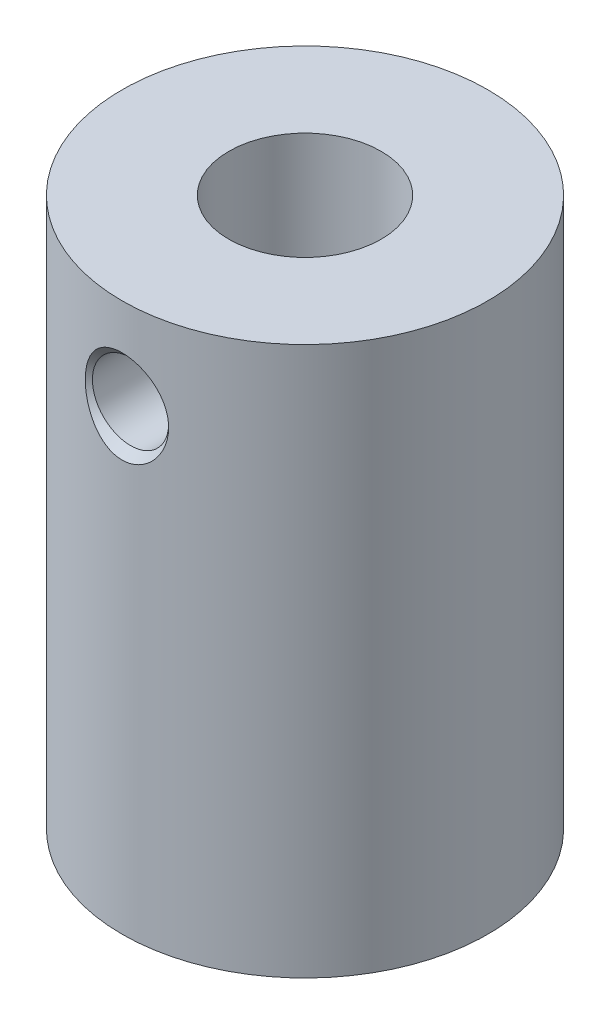
ISO-10303-21;
HEADER;
FILE_DESCRIPTION(('STEP AP214'),'2;1');
FILE_NAME('part.step','',(''),(''),'','','');
FILE_SCHEMA(('AUTOMOTIVE_DESIGN { 1 0 10303 214 1 1 1 1 }'));
ENDSEC;
DATA;
#1=APPLICATION_CONTEXT('core data for automotive mechanical design processes');
#2=APPLICATION_PROTOCOL_DEFINITION('international standard','automotive_design',2000,#1);
#3=PRODUCT_CONTEXT('',#1,'mechanical');
#4=PRODUCT('Part','Part','',(#3));
#5=PRODUCT_RELATED_PRODUCT_CATEGORY('part','',(#4));
#6=PRODUCT_DEFINITION_FORMATION('','',#4);
#7=PRODUCT_DEFINITION_CONTEXT('part definition',#1,'design');
#8=PRODUCT_DEFINITION('design','',#6,#7);
#9=PRODUCT_DEFINITION_SHAPE('','',#8);
#10=(LENGTH_UNIT() NAMED_UNIT(*) SI_UNIT(.MILLI.,.METRE.));
#11=(NAMED_UNIT(*) PLANE_ANGLE_UNIT() SI_UNIT($,.RADIAN.));
#12=(NAMED_UNIT(*) SI_UNIT($,.STERADIAN.) SOLID_ANGLE_UNIT());
#13=UNCERTAINTY_MEASURE_WITH_UNIT(LENGTH_MEASURE(1.E-05),#10,'distance_accuracy_value','');
#14=(GEOMETRIC_REPRESENTATION_CONTEXT(3) GLOBAL_UNCERTAINTY_ASSIGNED_CONTEXT((#13)) GLOBAL_UNIT_ASSIGNED_CONTEXT((#10,
#11,#12)) REPRESENTATION_CONTEXT('',''));
#15=CARTESIAN_POINT('',(0.,0.,0.));
#16=DIRECTION('',(0.,0.,1.));
#17=DIRECTION('',(1.,0.,0.));
#18=AXIS2_PLACEMENT_3D('',#15,#16,#17);
#19=CARTESIAN_POINT('',(0.,18.,0.));
#20=DIRECTION('',(0.,-1.,0.));
#21=DIRECTION('',(0.,0.,-1.));
#22=AXIS2_PLACEMENT_3D('',#19,#20,#21);
#23=CYLINDRICAL_SURFACE('',#22,2.5);
#24=CARTESIAN_POINT('',(0.,0.525000000000001,0.));
#25=DIRECTION('',(0.,-1.,0.));
#26=DIRECTION('',(0.,0.,-1.));
#27=AXIS2_PLACEMENT_3D('',#24,#25,#26);
#28=CIRCLE('',#27,2.5);
#29=CARTESIAN_POINT('',(0.,0.525000000000001,-2.5));
#30=VERTEX_POINT('',#29);
#31=EDGE_CURVE('E61',#30,#30,#28,.T.);
#32=ORIENTED_EDGE('',*,*,#31,.T.);
#33=EDGE_LOOP('',(#32));
#34=FACE_BOUND('',#33,.T.);
#35=CARTESIAN_POINT('',(1.525,15.,1.98100353356575));
#36=CARTESIAN_POINT('',(1.52499492171973,14.9237472213921,1.98101129789833));
#37=CARTESIAN_POINT('',(1.51922907839568,14.8473560659618,1.98548718326427));
#38=CARTESIAN_POINT('',(1.49655848145347,14.6970941693752,2.00262330984394));
#39=CARTESIAN_POINT('',(1.47962031728919,14.6232316892448,2.01530809742034));
#40=CARTESIAN_POINT('',(1.43576786079199,14.4806588850031,2.04677412274575));
#41=CARTESIAN_POINT('',(1.40893650458591,14.4119112824337,2.06550452101057));
#42=CARTESIAN_POINT('',(1.34630316554546,14.2799777286879,2.10686343501451));
#43=CARTESIAN_POINT('',(1.31050175711183,14.2167914217416,2.1294917011232));
#44=CARTESIAN_POINT('',(1.22563990373981,14.0889331097008,2.17957074598538));
#45=CARTESIAN_POINT('',(1.17547282184875,14.0250921833822,2.20726897245733));
#46=CARTESIAN_POINT('',(1.0655658868299,13.9060323941976,2.2623781635907));
#47=CARTESIAN_POINT('',(1.00581801705445,13.8508208289554,2.28978886702423));
#48=CARTESIAN_POINT('',(0.870272534013958,13.7444198082331,2.34490030781887));
#49=CARTESIAN_POINT('',(0.793424484679834,13.6943881393866,2.37228442298518));
#50=CARTESIAN_POINT('',(0.63041341873413,13.6083566505517,2.4206985385051));
#51=CARTESIAN_POINT('',(0.544259351699337,13.5723434997929,2.44173457120396));
#52=CARTESIAN_POINT('',(0.373989830773632,13.5191512236081,2.47323212045012));
#53=CARTESIAN_POINT('',(0.290500960367959,13.5004730720976,2.48452745034391));
#54=CARTESIAN_POINT('',(0.120891942139536,13.4773992143832,2.49851940159797));
#55=CARTESIAN_POINT('',(0.0347744671902498,13.4729894577756,2.501224481918));
#56=CARTESIAN_POINT('',(-0.125743840141964,13.4783483340295,2.49795938630501));
#57=CARTESIAN_POINT('',(-0.200233078496372,13.4863739081748,2.49305561328968));
#58=CARTESIAN_POINT('',(-0.346571351754475,13.5130419961731,2.47695494154555));
#59=CARTESIAN_POINT('',(-0.418420186896576,13.5316853115658,2.46575756770986));
#60=CARTESIAN_POINT('',(-0.558032645396032,13.5788441432916,2.43796958987444));
#61=CARTESIAN_POINT('',(-0.625776094438257,13.6074043951017,2.4213545678248));
#62=CARTESIAN_POINT('',(-0.755580439312915,13.6733394328193,2.38404386833898));
#63=CARTESIAN_POINT('',(-0.817639928925312,13.7107163918593,2.36334718506582));
#64=CARTESIAN_POINT('',(-0.942401898319157,13.7983341014371,2.31664325426361));
#65=CARTESIAN_POINT('',(-1.00426612603097,13.8495860968612,2.2902962981657));
#66=CARTESIAN_POINT('',(-1.11905100774202,13.9608878414764,2.23646019911834));
#67=CARTESIAN_POINT('',(-1.17195894296089,14.0209498797021,2.20896949978178));
#68=CARTESIAN_POINT('',(-1.27385380489807,14.1567998889763,2.15199865351112));
#69=CARTESIAN_POINT('',(-1.32157939831418,14.2336121688595,2.12268370171008));
#70=CARTESIAN_POINT('',(-1.40321363223876,14.3959853125246,2.06963104069322));
#71=CARTESIAN_POINT('',(-1.43714783370176,14.4815296206253,2.04588304858662));
#72=CARTESIAN_POINT('',(-1.48271437882387,14.6367350736794,2.01299230746254));
#73=CARTESIAN_POINT('',(-1.49782183190419,14.7049129998181,2.0016720844378));
#74=CARTESIAN_POINT('',(-1.51855394609946,14.8434486511503,1.98599354182264));
#75=CARTESIAN_POINT('',(-1.52419038273947,14.913803558591,1.98162657744618));
#76=CARTESIAN_POINT('',(-1.52564799438549,15.0547975496988,1.9805049039136));
#77=CARTESIAN_POINT('',(-1.52145226801517,15.1254369140216,1.98376330265693));
#78=CARTESIAN_POINT('',(-1.5034804604902,15.2647963499274,1.99741516325187));
#79=CARTESIAN_POINT('',(-1.4896966368959,15.3335148237008,2.00781439127396));
#80=CARTESIAN_POINT('',(-1.45340740666528,15.466884285527,2.03423196145524));
#81=CARTESIAN_POINT('',(-1.43096348486023,15.5315602945382,2.05021061652279));
#82=CARTESIAN_POINT('',(-1.37816622519893,15.65641709438,2.08606672890409));
#83=CARTESIAN_POINT('',(-1.34780998317732,15.7165962242032,2.10594561710906));
#84=CARTESIAN_POINT('',(-1.27359440731444,15.8425355260836,2.15178755744497));
#85=CARTESIAN_POINT('',(-1.22827681179747,15.9072748952501,2.17819630532248));
#86=CARTESIAN_POINT('',(-1.12834104438344,16.0289204185559,2.23160553827569));
#87=CARTESIAN_POINT('',(-1.07371362916917,16.085818685065,2.25860658798106));
#88=CARTESIAN_POINT('',(-0.947494256102587,16.1983315727948,2.31466361812934));
#89=CARTESIAN_POINT('',(-0.874595272646754,16.2526217561897,2.34346860181092));
#90=CARTESIAN_POINT('',(-0.718901983115556,16.3480063439564,2.39581051166219));
#91=CARTESIAN_POINT('',(-0.6361136117525,16.3891086084673,2.41935057323699));
#92=CARTESIAN_POINT('',(-0.468672987092279,16.4537750340264,2.45707063477176));
#93=CARTESIAN_POINT('',(-0.384532519388759,16.4783437545921,2.47177931356308));
#94=CARTESIAN_POINT('',(-0.212279035718039,16.5126955340819,2.49247451209789));
#95=CARTESIAN_POINT('',(-0.124171039271208,16.5224967633025,2.49847175029215));
#96=CARTESIAN_POINT('',(0.0401910320853529,16.5263709017881,2.50083738946254));
#97=CARTESIAN_POINT('',(0.116388777882104,16.5224424143792,2.49842938930696));
#98=CARTESIAN_POINT('',(0.266836533639423,16.5033861268299,2.48686281486913));
#99=CARTESIAN_POINT('',(0.341086560344628,16.4882584230024,2.47770429864111));
#100=CARTESIAN_POINT('',(0.483936965853624,16.4480383696321,2.45375984543673));
#101=CARTESIAN_POINT('',(0.552628256592004,16.4231843988741,2.43910885884555));
#102=CARTESIAN_POINT('',(0.684849461574841,16.3644936490671,2.40533630023946));
#103=CARTESIAN_POINT('',(0.748378359727262,16.3306551071888,2.38621385098351));
#104=CARTESIAN_POINT('',(0.875820971152278,16.250921023234,2.34263624333162));
#105=CARTESIAN_POINT('',(0.939047795302068,16.2041225365883,2.31782935025686));
#106=CARTESIAN_POINT('',(1.05723366080752,16.1018176983202,2.2663674570174));
#107=CARTESIAN_POINT('',(1.11218298662153,16.0463012678383,2.23971033795267));
#108=CARTESIAN_POINT('',(1.21984942582394,15.9194646196159,2.18314865852935));
#109=CARTESIAN_POINT('',(1.27127714427543,15.8470233531553,2.15328842601601));
#110=CARTESIAN_POINT('',(1.36129177654849,15.6931327774586,2.09754453551839));
#111=CARTESIAN_POINT('',(1.39988816924632,15.6116901773012,2.07165794972857));
#112=CARTESIAN_POINT('',(1.45555819839569,15.4603793694066,2.03279034740367));
#113=CARTESIAN_POINT('',(1.47551186037458,15.3919790456218,2.01821876267025));
#114=CARTESIAN_POINT('',(1.50570389400192,15.2521116543796,1.99580073738226));
#115=CARTESIAN_POINT('',(1.51597432734032,15.1806555323177,1.9879321113816));
#116=CARTESIAN_POINT('',(1.52241220729945,15.0906489059279,1.9829929818964));
#117=CARTESIAN_POINT('',(1.52338141760783,15.0725442441286,1.98224872168731));
#118=CARTESIAN_POINT('',(1.52467597564328,15.0362956729308,1.98125302956268));
#119=CARTESIAN_POINT('',(1.52500120887018,15.018151757127,1.98100168528846));
#120=CARTESIAN_POINT('',(1.525,15.,1.98100353356575));
#121=B_SPLINE_CURVE_WITH_KNOTS('',3,(#35,#36,#37,#38,#39,#40,#41,#42,#43,#44,#45,#46,#47,#48,
#49,#50,#51,#52,#53,#54,#55,#56,#57,#58,#59,#60,#61,#62,#63,#64,#65,#66,#67,#68,#69,#70,#71,#72,
#73,#74,#75,#76,#77,#78,#79,#80,#81,#82,#83,#84,#85,#86,#87,#88,#89,#90,#91,#92,#93,#94,#95,#96,
#97,#98,#99,#100,#101,#102,#103,#104,#105,#106,#107,#108,#109,#110,#111,#112,#113,#114,#115,
#116,#117,#118,#119,#120),.UNSPECIFIED.,.T.,.F.,(4,2,2,2,2,2,2,2,2,2,2,2,2,2,2,2,2,2,2,2,2,2,2,
2,2,2,2,2,2,2,2,2,2,2,2,2,2,2,2,2,2,2,4),(0.,0.228674727302821,0.45803642006556,
0.685517504561196,0.912984025939703,1.16934864128595,1.4259288978906,1.71147615038918,
1.99675119731817,2.25408958921758,2.511174497074,2.7353431922148,2.95952881222954,
3.18473916578186,3.41000508705098,3.66264452589884,3.91563978041089,4.19943258312745,
4.48269697914798,4.69402695598139,4.90509398661276,5.11652410514946,5.32812515313112,
5.53825073013599,5.74845354123268,5.99746395344112,6.24672305319811,6.53130347395549,
6.81571396534028,7.08073630439864,7.34543228617464,7.57330017737474,7.80116610894088,
8.0237657054468,8.24640900970455,8.49288731243608,8.73965269682945,9.01953711215542,
9.29921430683183,9.51653575674796,9.7331350902332,9.78756078273721,9.84199615134741),.UNSPECIFIED.);
#122=CARTESIAN_POINT('',(0.,13.475,2.5));
#123=VERTEX_POINT('',#122);
#124=CARTESIAN_POINT('',(0.,16.525,2.5));
#125=VERTEX_POINT('',#124);
#126=EDGE_CURVE('E42',#123,#125,#121,.T.);
#127=ORIENTED_EDGE('',*,*,#126,.F.);
#128=EDGE_CURVE('E55',#125,#123,#121,.T.);
#129=ORIENTED_EDGE('',*,*,#128,.F.);
#130=EDGE_LOOP('',(#127,#129));
#131=FACE_BOUND('',#130,.T.);
#132=CARTESIAN_POINT('',(0.,18.,0.));
#133=DIRECTION('',(0.,1.,0.));
#134=DIRECTION('',(0.,0.,1.));
#135=AXIS2_PLACEMENT_3D('',#132,#133,#134);
#136=CIRCLE('',#135,2.5);
#137=CARTESIAN_POINT('',(0.,18.,2.5));
#138=VERTEX_POINT('',#137);
#139=EDGE_CURVE('E104',#138,#138,#136,.T.);
#140=ORIENTED_EDGE('',*,*,#139,.T.);
#141=EDGE_LOOP('',(#140));
#142=FACE_BOUND('',#141,.T.);
#143=ADVANCED_FACE('F31',(#34,#131,#142),#23,.F.);
#144=CARTESIAN_POINT('',(0.,18.,0.));
#145=DIRECTION('',(0.,1.,0.));
#146=DIRECTION('',(0.,0.,1.));
#147=AXIS2_PLACEMENT_3D('',#144,#145,#146);
#148=PLANE('',#147);
#149=CARTESIAN_POINT('',(0.,18.,0.));
#150=DIRECTION('',(0.,1.,0.));
#151=DIRECTION('',(0.,0.,1.));
#152=AXIS2_PLACEMENT_3D('',#149,#150,#151);
#153=CIRCLE('',#152,6.);
#154=CARTESIAN_POINT('',(0.,18.,6.));
#155=VERTEX_POINT('',#154);
#156=EDGE_CURVE('E67',#155,#155,#153,.T.);
#157=ORIENTED_EDGE('',*,*,#156,.T.);
#158=EDGE_LOOP('',(#157));
#159=FACE_BOUND('',#158,.T.);
#160=ORIENTED_EDGE('',*,*,#139,.F.);
#161=EDGE_LOOP('',(#160));
#162=FACE_BOUND('',#161,.T.);
#163=ADVANCED_FACE('F79',(#159,#162),#148,.T.);
#164=CARTESIAN_POINT('',(0.,0.,0.));
#165=DIRECTION('',(0.,1.,0.));
#166=DIRECTION('',(0.,0.,1.));
#167=AXIS2_PLACEMENT_3D('',#164,#165,#166);
#168=PLANE('',#167);
#169=CARTESIAN_POINT('',(0.,0.,0.));
#170=DIRECTION('',(0.,-1.,0.));
#171=DIRECTION('',(0.,0.,-1.));
#172=AXIS2_PLACEMENT_3D('',#169,#170,#171);
#173=CIRCLE('',#172,3.025);
#174=CARTESIAN_POINT('',(0.,0.,-3.025));
#175=VERTEX_POINT('',#174);
#176=EDGE_CURVE('E116',#175,#175,#173,.T.);
#177=ORIENTED_EDGE('',*,*,#176,.F.);
#178=EDGE_LOOP('',(#177));
#179=FACE_BOUND('',#178,.T.);
#180=CARTESIAN_POINT('',(0.,0.,0.));
#181=DIRECTION('',(0.,1.,0.));
#182=DIRECTION('',(0.,0.,1.));
#183=AXIS2_PLACEMENT_3D('',#180,#181,#182);
#184=CIRCLE('',#183,6.);
#185=CARTESIAN_POINT('',(0.,0.,6.));
#186=VERTEX_POINT('',#185);
#187=EDGE_CURVE('E69',#186,#186,#184,.T.);
#188=ORIENTED_EDGE('',*,*,#187,.F.);
#189=EDGE_LOOP('',(#188));
#190=FACE_BOUND('',#189,.T.);
#191=ADVANCED_FACE('F84',(#179,#190),#168,.F.);
#192=CARTESIAN_POINT('',(0.,18.,0.));
#193=DIRECTION('',(0.,-1.,0.));
#194=DIRECTION('',(0.,0.,-1.));
#195=AXIS2_PLACEMENT_3D('',#192,#193,#194);
#196=CYLINDRICAL_SURFACE('',#195,6.);
#197=CARTESIAN_POINT('',(-1.00732038769462,13.9711956528146,5.91483775658699));
#198=CARTESIAN_POINT('',(-1.0625572167337,14.0384490800039,5.90543128244687));
#199=CARTESIAN_POINT('',(-1.1119450928033,14.1106266973016,5.89622727626031));
#200=CARTESIAN_POINT('',(-1.19816011091402,14.2623799059806,5.87931576917396));
#201=CARTESIAN_POINT('',(-1.23496409543613,14.3419687972875,5.87161103842038));
#202=CARTESIAN_POINT('',(-1.29550008714942,14.5064827721371,5.85855311445987));
#203=CARTESIAN_POINT('',(-1.31918435597302,14.591426106717,5.8532085231466));
#204=CARTESIAN_POINT('',(-1.35290234778387,14.7640651682596,5.84550733148309));
#205=CARTESIAN_POINT('',(-1.36294121055757,14.8517598461385,5.8431496060991));
#206=CARTESIAN_POINT('',(-1.3693652007367,15.0314699888036,5.84164829843658));
#207=CARTESIAN_POINT('',(-1.36514396828115,15.1235089472637,5.84264744553621));
#208=CARTESIAN_POINT('',(-1.34176422645992,15.3055913672038,5.84806031937853));
#209=CARTESIAN_POINT('',(-1.32260179220375,15.3956342979564,5.85247494332733));
#210=CARTESIAN_POINT('',(-1.26955658372633,15.571455538672,5.86421037888129));
#211=CARTESIAN_POINT('',(-1.23561954165774,15.6572168148894,5.87154189574134));
#212=CARTESIAN_POINT('',(-1.15355452356077,15.8214896285567,5.88821351349967));
#213=CARTESIAN_POINT('',(-1.10542559254557,15.9000006776645,5.89755374955527));
#214=CARTESIAN_POINT('',(-0.997431067079705,16.0448106928749,5.91675947634123));
#215=CARTESIAN_POINT('',(-0.937956064421905,16.1114028757775,5.92660116071936));
#216=CARTESIAN_POINT('',(-0.807572778572501,16.2323901106385,5.9457671407107));
#217=CARTESIAN_POINT('',(-0.736672119814305,16.286793238982,5.9550917758162));
#218=CARTESIAN_POINT('',(-0.592229184508393,16.3762518231714,5.97110086326186));
#219=CARTESIAN_POINT('',(-0.519522334296953,16.4126221867845,5.97794883133935));
#220=CARTESIAN_POINT('',(-0.368354061775826,16.4708855125874,5.98915923947937));
#221=CARTESIAN_POINT('',(-0.289899115696946,16.4927944976266,5.99352442965381));
#222=CARTESIAN_POINT('',(-0.139790161066982,16.5190323166964,5.99878383296519));
#223=CARTESIAN_POINT('',(-0.0684608162744479,16.5251664888293,6.00003390907518));
#224=CARTESIAN_POINT('',(0.0741565668801903,16.5248268419741,5.99996473941875));
#225=CARTESIAN_POINT('',(0.145444611044834,16.5183573019057,5.99864636563278));
#226=CARTESIAN_POINT('',(0.281699711330631,16.4939071631755,5.99374965828111));
#227=CARTESIAN_POINT('',(0.346795376060321,16.4766042077672,5.99030452290538));
#228=CARTESIAN_POINT('',(0.473295716776516,16.4319346045143,5.98163978874799));
#229=CARTESIAN_POINT('',(0.534699911497291,16.4045666477676,5.97641995918308));
#230=CARTESIAN_POINT('',(0.655148937892168,16.3394349372709,5.96444546834219));
#231=CARTESIAN_POINT('',(0.713964814463624,16.3012603652792,5.95763252098112));
#232=CARTESIAN_POINT('',(0.82507501536845,16.216506750001,5.94326477324329));
#233=CARTESIAN_POINT('',(0.8773667917489,16.1699244403857,5.93570968507338));
#234=CARTESIAN_POINT('',(0.979878874616082,16.0643720246854,5.91969696852427));
#235=CARTESIAN_POINT('',(1.02928222856886,16.0046103660667,5.91122908464167));
#236=CARTESIAN_POINT('',(1.11849706997978,15.8782301489951,5.89499995296438));
#237=CARTESIAN_POINT('',(1.15830421538346,15.8116085059479,5.88723902603517));
#238=CARTESIAN_POINT('',(1.23150221770142,15.6658545434079,5.87238854278172));
#239=CARTESIAN_POINT('',(1.26377583596079,15.5861435788877,5.86545576964514));
#240=CARTESIAN_POINT('',(1.31553900889379,15.4225053355997,5.85406362893617));
#241=CARTESIAN_POINT('',(1.33502492532302,15.3385768642095,5.84960496533133));
#242=CARTESIAN_POINT('',(1.36167438773833,15.1636712904829,5.84346196331302));
#243=CARTESIAN_POINT('',(1.36805648423666,15.0725679248454,5.84195380587374));
#244=CARTESIAN_POINT('',(1.36606722652635,14.8905254172031,5.84241898623785));
#245=CARTESIAN_POINT('',(1.35769381176682,14.7995862999103,5.84439281028674));
#246=CARTESIAN_POINT('',(1.3261106711044,14.6191274824514,5.8516404284706));
#247=CARTESIAN_POINT('',(1.30269440448541,14.5296456069014,5.85696014054536));
#248=CARTESIAN_POINT('',(1.24121316011803,14.3560449957163,5.87029590269997));
#249=CARTESIAN_POINT('',(1.20314612768998,14.2719270142641,5.87831233095778));
#250=CARTESIAN_POINT('',(1.1136494956924,14.1129176278089,5.895916249366));
#251=CARTESIAN_POINT('',(1.06242403970803,14.03790900811,5.90547897651683));
#252=CARTESIAN_POINT('',(0.94722814343741,13.8984251709324,5.92504502332219));
#253=CARTESIAN_POINT('',(0.883261528037211,13.8339468028269,5.93504821005079));
#254=CARTESIAN_POINT('',(0.748703574776039,13.7223718583097,5.95346362496181));
#255=CARTESIAN_POINT('',(0.67885535522889,13.6743932395613,5.96193773582487));
#256=CARTESIAN_POINT('',(0.531105524715202,13.5926261830056,5.9769062092819));
#257=CARTESIAN_POINT('',(0.453213174667969,13.5588216491278,5.98340281521654));
#258=CARTESIAN_POINT('',(0.301742486861648,13.5106112244505,5.99282925286203));
#259=CARTESIAN_POINT('',(0.228770506103553,13.4943624097815,5.99609387934914));
#260=CARTESIAN_POINT('',(0.0810310347313786,13.4754328442664,5.99990641356615));
#261=CARTESIAN_POINT('',(0.0062647778679684,13.4727430244082,6.00045613716958));
#262=CARTESIAN_POINT('',(-0.135775253712958,13.4806986023412,5.99884670170859));
#263=CARTESIAN_POINT('',(-0.203121027444958,13.4901727392506,5.99692544307746));
#264=CARTESIAN_POINT('',(-0.335264748290143,13.5199983192442,5.99099100463259));
#265=CARTESIAN_POINT('',(-0.400062186390655,13.5403519236998,5.98697740914826));
#266=CARTESIAN_POINT('',(-0.526115404644997,13.5912642154155,5.97722735475829));
#267=CARTESIAN_POINT('',(-0.58732833618892,13.6219248410455,5.97147374623539));
#268=CARTESIAN_POINT('',(-0.704205646800114,13.6921677598888,5.95882130341706));
#269=CARTESIAN_POINT('',(-0.759873062239021,13.7317451317068,5.95192310140536));
#270=CARTESIAN_POINT('',(-0.847902845940636,13.8045540633753,5.93989518893234));
#271=CARTESIAN_POINT('',(-0.88200657651437,13.8357391258349,5.93490934552203));
#272=CARTESIAN_POINT('',(-0.94706242091887,13.9012193568667,5.92487592256493));
#273=CARTESIAN_POINT('',(-0.978014589884656,13.9355144710103,5.91982834409989));
#274=CARTESIAN_POINT('',(-1.00732038769462,13.9711956528146,5.91483775658699));
#275=B_SPLINE_CURVE_WITH_KNOTS('',3,(#197,#198,#199,#200,#201,#202,#203,#204,#205,#206,#207,
#208,#209,#210,#211,#212,#213,#214,#215,#216,#217,#218,#219,#220,#221,#222,#223,#224,#225,#226,
#227,#228,#229,#230,#231,#232,#233,#234,#235,#236,#237,#238,#239,#240,#241,#242,#243,#244,#245,
#246,#247,#248,#249,#250,#251,#252,#253,#254,#255,#256,#257,#258,#259,#260,#261,#262,#263,#264,
#265,#266,#267,#268,#269,#270,#271,#272,#273,#274),.UNSPECIFIED.,.T.,.F.,(4,2,2,2,2,2,2,2,2,2,2,
2,2,2,2,2,2,2,2,2,2,2,2,2,2,2,2,2,2,2,2,2,2,2,2,2,2,2,4),(0.,0.262436347529809,
0.525353076759216,0.789220293463884,1.05298809229006,1.32811039544879,1.6033049945899,
1.87951903929043,2.1557516749615,2.42378855151125,2.69164729993872,2.93499491007315,
3.17807244246412,3.39175918356618,3.60537339135055,3.80680298500644,4.00825878282087,
4.21874018382816,4.42930353161712,4.66234338592003,4.89548848808494,5.15318720780322,
5.41095921394385,5.6837032303038,5.95648533734414,6.23309524058099,6.50974395079712,
6.78233570784822,7.05484575606621,7.30888108663872,7.56262714858271,7.7858815721096,
8.00898665079045,8.21213588750412,8.41532549790892,8.62058689753882,8.82573528413764,
8.96497284079322,9.10420796113756),.UNSPECIFIED.);
#276=CARTESIAN_POINT('',(-1.00732038769462,13.9711956528146,5.91483775658699));
#277=VERTEX_POINT('',#276);
#278=EDGE_CURVE('E11',#277,#277,#275,.T.);
#279=ORIENTED_EDGE('',*,*,#278,.T.);
#280=EDGE_LOOP('',(#279));
#281=FACE_BOUND('',#280,.T.);
#282=ORIENTED_EDGE('',*,*,#156,.F.);
#283=EDGE_LOOP('',(#282));
#284=FACE_BOUND('',#283,.T.);
#285=ORIENTED_EDGE('',*,*,#187,.T.);
#286=EDGE_LOOP('',(#285));
#287=FACE_BOUND('',#286,.T.);
#288=ADVANCED_FACE('F87',(#281,#284,#287),#196,.T.);
#289=CARTESIAN_POINT('',(0.,15.,6.));
#290=DIRECTION('',(0.,0.,1.));
#291=DIRECTION('',(1.,0.,0.));
#292=AXIS2_PLACEMENT_3D('',#289,#290,#291);
#293=CONICAL_SURFACE('',#292,1.525,0.785398163397447);
#294=CARTESIAN_POINT('',(0.,15.,5.725));
#295=DIRECTION('',(0.,0.,1.));
#296=DIRECTION('',(1.,0.,0.));
#297=AXIS2_PLACEMENT_3D('',#294,#295,#296);
#298=CIRCLE('',#297,1.25);
#299=CARTESIAN_POINT('',(1.25,15.,5.725));
#300=VERTEX_POINT('',#299);
#301=EDGE_CURVE('E65',#300,#300,#298,.T.);
#302=ORIENTED_EDGE('',*,*,#301,.F.);
#303=EDGE_LOOP('',(#302));
#304=FACE_BOUND('',#303,.T.);
#305=ORIENTED_EDGE('',*,*,#278,.F.);
#306=EDGE_LOOP('',(#305));
#307=FACE_BOUND('',#306,.T.);
#308=ADVANCED_FACE('F91',(#304,#307),#293,.F.);
#309=CARTESIAN_POINT('',(0.,15.,2.5));
#310=DIRECTION('',(0.,0.,1.));
#311=DIRECTION('',(1.,0.,0.));
#312=AXIS2_PLACEMENT_3D('',#309,#310,#311);
#313=CYLINDRICAL_SURFACE('',#312,1.525);
#314=ORIENTED_EDGE('',*,*,#126,.T.);
#315=CARTESIAN_POINT('',(0.,15.,2.5));
#316=DIRECTION('',(0.,0.,1.));
#317=DIRECTION('',(1.,0.,0.));
#318=AXIS2_PLACEMENT_3D('',#315,#316,#317);
#319=CIRCLE('',#318,1.525);
#320=EDGE_CURVE('E48',#125,#123,#319,.T.);
#321=ORIENTED_EDGE('',*,*,#320,.T.);
#322=EDGE_LOOP('',(#314,#321));
#323=FACE_BOUND('',#322,.T.);
#324=ADVANCED_FACE('F52',(#323),#313,.F.);
#325=ORIENTED_EDGE('',*,*,#128,.T.);
#326=EDGE_CURVE('E58',#123,#125,#319,.T.);
#327=ORIENTED_EDGE('',*,*,#326,.T.);
#328=EDGE_LOOP('',(#325,#327));
#329=FACE_BOUND('',#328,.T.);
#330=ADVANCED_FACE('F59',(#329),#313,.F.);
#331=CARTESIAN_POINT('',(0.,15.,2.775));
#332=DIRECTION('',(0.,0.,-1.));
#333=DIRECTION('',(-1.,0.,0.));
#334=AXIS2_PLACEMENT_3D('',#331,#332,#333);
#335=CONICAL_SURFACE('',#334,1.25,0.785398163397448);
#336=ORIENTED_EDGE('',*,*,#320,.F.);
#337=ORIENTED_EDGE('',*,*,#326,.F.);
#338=EDGE_LOOP('',(#336,#337));
#339=FACE_BOUND('',#338,.T.);
#340=CARTESIAN_POINT('',(0.,15.,2.775));
#341=DIRECTION('',(0.,0.,1.));
#342=DIRECTION('',(1.,0.,0.));
#343=AXIS2_PLACEMENT_3D('',#340,#341,#342);
#344=CIRCLE('',#343,1.25);
#345=CARTESIAN_POINT('',(1.25,15.,2.775));
#346=VERTEX_POINT('',#345);
#347=EDGE_CURVE('E106',#346,#346,#344,.T.);
#348=ORIENTED_EDGE('',*,*,#347,.T.);
#349=EDGE_LOOP('',(#348));
#350=FACE_BOUND('',#349,.T.);
#351=ADVANCED_FACE('F63',(#339,#350),#335,.F.);
#352=CARTESIAN_POINT('',(0.,15.,6.));
#353=DIRECTION('',(0.,0.,1.));
#354=DIRECTION('',(1.,0.,0.));
#355=AXIS2_PLACEMENT_3D('',#352,#353,#354);
#356=CYLINDRICAL_SURFACE('',#355,1.25);
#357=ORIENTED_EDGE('',*,*,#347,.F.);
#358=EDGE_LOOP('',(#357));
#359=FACE_BOUND('',#358,.T.);
#360=ORIENTED_EDGE('',*,*,#301,.T.);
#361=EDGE_LOOP('',(#360));
#362=FACE_BOUND('',#361,.T.);
#363=ADVANCED_FACE('F122',(#359,#362),#356,.F.);
#364=CARTESIAN_POINT('',(0.,0.,0.));
#365=DIRECTION('',(0.,-1.,0.));
#366=DIRECTION('',(0.,0.,-1.));
#367=AXIS2_PLACEMENT_3D('',#364,#365,#366);
#368=CONICAL_SURFACE('',#367,3.025,0.785398163397449);
#369=ORIENTED_EDGE('',*,*,#31,.F.);
#370=EDGE_LOOP('',(#369));
#371=FACE_BOUND('',#370,.T.);
#372=ORIENTED_EDGE('',*,*,#176,.T.);
#373=EDGE_LOOP('',(#372));
#374=FACE_BOUND('',#373,.T.);
#375=ADVANCED_FACE('F120',(#371,#374),#368,.F.);
#376=CLOSED_SHELL('',(#143,#163,#191,#288,#308,#324,#330,#351,#363,#375));
#377=MANIFOLD_SOLID_BREP('B2',#376);
#378=ADVANCED_BREP_SHAPE_REPRESENTATION('',(#18,#377),#14);
#379=SHAPE_DEFINITION_REPRESENTATION(#9,#378);
ENDSEC;
END-ISO-10303-21;
